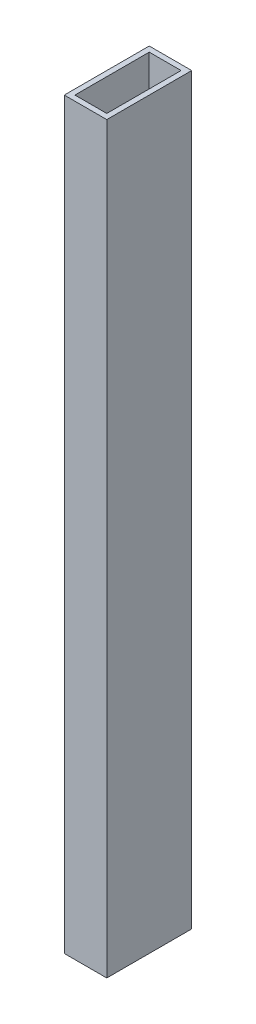
ISO-10303-21;
HEADER;
FILE_DESCRIPTION(('STEP AP214'),'2;1');
FILE_NAME('part.step','',(''),(''),'','','');
FILE_SCHEMA(('AUTOMOTIVE_DESIGN { 1 0 10303 214 1 1 1 1 }'));
ENDSEC;
DATA;
#1=APPLICATION_CONTEXT('core data for automotive mechanical design processes');
#2=APPLICATION_PROTOCOL_DEFINITION('international standard','automotive_design',2000,#1);
#3=PRODUCT_CONTEXT('',#1,'mechanical');
#4=PRODUCT('Part','Part','',(#3));
#5=PRODUCT_RELATED_PRODUCT_CATEGORY('part','',(#4));
#6=PRODUCT_DEFINITION_FORMATION('','',#4);
#7=PRODUCT_DEFINITION_CONTEXT('part definition',#1,'design');
#8=PRODUCT_DEFINITION('design','',#6,#7);
#9=PRODUCT_DEFINITION_SHAPE('','',#8);
#10=(LENGTH_UNIT() NAMED_UNIT(*) SI_UNIT(.MILLI.,.METRE.));
#11=(NAMED_UNIT(*) PLANE_ANGLE_UNIT() SI_UNIT($,.RADIAN.));
#12=(NAMED_UNIT(*) SI_UNIT($,.STERADIAN.) SOLID_ANGLE_UNIT());
#13=UNCERTAINTY_MEASURE_WITH_UNIT(LENGTH_MEASURE(1.E-05),#10,'distance_accuracy_value','');
#14=(GEOMETRIC_REPRESENTATION_CONTEXT(3) GLOBAL_UNCERTAINTY_ASSIGNED_CONTEXT((#13)) GLOBAL_UNIT_ASSIGNED_CONTEXT((#10,
#11,#12)) REPRESENTATION_CONTEXT('',''));
#15=CARTESIAN_POINT('',(0.,0.,0.));
#16=DIRECTION('',(0.,0.,1.));
#17=DIRECTION('',(1.,0.,0.));
#18=AXIS2_PLACEMENT_3D('',#15,#16,#17);
#19=CARTESIAN_POINT('',(0.,444.5,0.));
#20=DIRECTION('',(0.,-1.,0.));
#21=DIRECTION('',(0.,0.,-1.));
#22=AXIS2_PLACEMENT_3D('',#19,#20,#21);
#23=PLANE('',#22);
#24=DIRECTION('',(0.,0.,1.));
#25=VECTOR('',#24,1.);
#26=CARTESIAN_POINT('',(0.,444.5,0.));
#27=LINE('',#26,#25);
#28=CARTESIAN_POINT('',(0.,444.5,-50.8));
#29=VERTEX_POINT('',#28);
#30=CARTESIAN_POINT('',(0.,444.5,0.));
#31=VERTEX_POINT('',#30);
#32=EDGE_CURVE('E133',#29,#31,#27,.T.);
#33=ORIENTED_EDGE('',*,*,#32,.T.);
#34=DIRECTION('',(1.,0.,0.));
#35=VECTOR('',#34,1.);
#36=CARTESIAN_POINT('',(0.,444.5,0.));
#37=LINE('',#36,#35);
#38=CARTESIAN_POINT('',(25.4,444.5,0.));
#39=VERTEX_POINT('',#38);
#40=EDGE_CURVE('E136',#31,#39,#37,.T.);
#41=ORIENTED_EDGE('',*,*,#40,.T.);
#42=DIRECTION('',(0.,0.,-1.));
#43=VECTOR('',#42,1.);
#44=CARTESIAN_POINT('',(25.4,444.5,0.));
#45=LINE('',#44,#43);
#46=CARTESIAN_POINT('',(25.4,444.5,-50.8));
#47=VERTEX_POINT('',#46);
#48=EDGE_CURVE('E139',#39,#47,#45,.T.);
#49=ORIENTED_EDGE('',*,*,#48,.T.);
#50=DIRECTION('',(-1.,0.,0.));
#51=VECTOR('',#50,1.);
#52=CARTESIAN_POINT('',(0.,444.5,-50.8));
#53=LINE('',#52,#51);
#54=EDGE_CURVE('E141',#47,#29,#53,.T.);
#55=ORIENTED_EDGE('',*,*,#54,.T.);
#56=EDGE_LOOP('',(#33,#41,#49,#55));
#57=FACE_BOUND('',#56,.T.);
#58=DIRECTION('',(0.,0.,1.));
#59=VECTOR('',#58,1.);
#60=CARTESIAN_POINT('',(3.175,444.5,-47.625));
#61=LINE('',#60,#59);
#62=CARTESIAN_POINT('',(3.175,444.5,-47.625));
#63=VERTEX_POINT('',#62);
#64=CARTESIAN_POINT('',(3.17500000000001,444.5,-3.175));
#65=VERTEX_POINT('',#64);
#66=EDGE_CURVE('E97',#63,#65,#61,.T.);
#67=ORIENTED_EDGE('',*,*,#66,.F.);
#68=DIRECTION('',(-1.,0.,0.));
#69=VECTOR('',#68,1.);
#70=CARTESIAN_POINT('',(3.175,444.5,-47.625));
#71=LINE('',#70,#69);
#72=CARTESIAN_POINT('',(22.225,444.5,-47.625));
#73=VERTEX_POINT('',#72);
#74=EDGE_CURVE('E119',#73,#63,#71,.T.);
#75=ORIENTED_EDGE('',*,*,#74,.F.);
#76=DIRECTION('',(0.,0.,-1.));
#77=VECTOR('',#76,1.);
#78=CARTESIAN_POINT('',(22.225,444.5,-47.625));
#79=LINE('',#78,#77);
#80=CARTESIAN_POINT('',(22.225,444.5,-3.175));
#81=VERTEX_POINT('',#80);
#82=EDGE_CURVE('E117',#81,#73,#79,.T.);
#83=ORIENTED_EDGE('',*,*,#82,.F.);
#84=DIRECTION('',(1.,0.,0.));
#85=VECTOR('',#84,1.);
#86=CARTESIAN_POINT('',(3.17500000000001,444.5,-3.175));
#87=LINE('',#86,#85);
#88=EDGE_CURVE('E105',#65,#81,#87,.T.);
#89=ORIENTED_EDGE('',*,*,#88,.F.);
#90=EDGE_LOOP('',(#67,#75,#83,#89));
#91=FACE_BOUND('',#90,.T.);
#92=ADVANCED_FACE('F32',(#57,#91),#23,.F.);
#93=CARTESIAN_POINT('',(0.,0.,0.));
#94=DIRECTION('',(0.,-1.,0.));
#95=DIRECTION('',(0.,0.,-1.));
#96=AXIS2_PLACEMENT_3D('',#93,#94,#95);
#97=PLANE('',#96);
#98=DIRECTION('',(0.,0.,1.));
#99=VECTOR('',#98,1.);
#100=CARTESIAN_POINT('',(0.,0.,0.));
#101=LINE('',#100,#99);
#102=CARTESIAN_POINT('',(0.,0.,-50.8));
#103=VERTEX_POINT('',#102);
#104=CARTESIAN_POINT('',(0.,0.,0.));
#105=VERTEX_POINT('',#104);
#106=EDGE_CURVE('E113',#103,#105,#101,.T.);
#107=ORIENTED_EDGE('',*,*,#106,.F.);
#108=DIRECTION('',(-1.,0.,0.));
#109=VECTOR('',#108,1.);
#110=CARTESIAN_POINT('',(0.,0.,-50.8));
#111=LINE('',#110,#109);
#112=CARTESIAN_POINT('',(25.4,0.,-50.8));
#113=VERTEX_POINT('',#112);
#114=EDGE_CURVE('E137',#113,#103,#111,.T.);
#115=ORIENTED_EDGE('',*,*,#114,.F.);
#116=DIRECTION('',(0.,0.,-1.));
#117=VECTOR('',#116,1.);
#118=CARTESIAN_POINT('',(25.4,0.,0.));
#119=LINE('',#118,#117);
#120=CARTESIAN_POINT('',(25.4,0.,0.));
#121=VERTEX_POINT('',#120);
#122=EDGE_CURVE('E148',#121,#113,#119,.T.);
#123=ORIENTED_EDGE('',*,*,#122,.F.);
#124=DIRECTION('',(1.,0.,0.));
#125=VECTOR('',#124,1.);
#126=CARTESIAN_POINT('',(0.,0.,0.));
#127=LINE('',#126,#125);
#128=EDGE_CURVE('E146',#105,#121,#127,.T.);
#129=ORIENTED_EDGE('',*,*,#128,.F.);
#130=EDGE_LOOP('',(#107,#115,#123,#129));
#131=FACE_BOUND('',#130,.T.);
#132=DIRECTION('',(-1.,0.,0.));
#133=VECTOR('',#132,1.);
#134=CARTESIAN_POINT('',(3.175,0.,-47.625));
#135=LINE('',#134,#133);
#136=CARTESIAN_POINT('',(22.225,0.,-47.625));
#137=VERTEX_POINT('',#136);
#138=CARTESIAN_POINT('',(3.175,0.,-47.625));
#139=VERTEX_POINT('',#138);
#140=EDGE_CURVE('E106',#137,#139,#135,.T.);
#141=ORIENTED_EDGE('',*,*,#140,.T.);
#142=DIRECTION('',(0.,0.,1.));
#143=VECTOR('',#142,1.);
#144=CARTESIAN_POINT('',(3.175,0.,-47.625));
#145=LINE('',#144,#143);
#146=CARTESIAN_POINT('',(3.17500000000001,0.,-3.175));
#147=VERTEX_POINT('',#146);
#148=EDGE_CURVE('E55',#139,#147,#145,.T.);
#149=ORIENTED_EDGE('',*,*,#148,.T.);
#150=DIRECTION('',(1.,0.,0.));
#151=VECTOR('',#150,1.);
#152=CARTESIAN_POINT('',(3.17500000000001,0.,-3.175));
#153=LINE('',#152,#151);
#154=CARTESIAN_POINT('',(22.225,0.,-3.175));
#155=VERTEX_POINT('',#154);
#156=EDGE_CURVE('E112',#147,#155,#153,.T.);
#157=ORIENTED_EDGE('',*,*,#156,.T.);
#158=DIRECTION('',(0.,0.,-1.));
#159=VECTOR('',#158,1.);
#160=CARTESIAN_POINT('',(22.225,0.,-47.625));
#161=LINE('',#160,#159);
#162=EDGE_CURVE('E125',#155,#137,#161,.T.);
#163=ORIENTED_EDGE('',*,*,#162,.T.);
#164=EDGE_LOOP('',(#141,#149,#157,#163));
#165=FACE_BOUND('',#164,.T.);
#166=ADVANCED_FACE('F166',(#131,#165),#97,.T.);
#167=CARTESIAN_POINT('',(0.,444.5,0.));
#168=DIRECTION('',(1.,0.,0.));
#169=DIRECTION('',(0.,0.,-1.));
#170=AXIS2_PLACEMENT_3D('',#167,#168,#169);
#171=PLANE('',#170);
#172=ORIENTED_EDGE('',*,*,#106,.T.);
#173=DIRECTION('',(0.,-1.,0.));
#174=VECTOR('',#173,1.);
#175=CARTESIAN_POINT('',(0.,444.5,0.));
#176=LINE('',#175,#174);
#177=EDGE_CURVE('E11',#31,#105,#176,.T.);
#178=ORIENTED_EDGE('',*,*,#177,.F.);
#179=ORIENTED_EDGE('',*,*,#32,.F.);
#180=DIRECTION('',(0.,-1.,0.));
#181=VECTOR('',#180,1.);
#182=CARTESIAN_POINT('',(0.,444.5,-50.8));
#183=LINE('',#182,#181);
#184=EDGE_CURVE('E143',#29,#103,#183,.T.);
#185=ORIENTED_EDGE('',*,*,#184,.T.);
#186=EDGE_LOOP('',(#172,#178,#179,#185));
#187=FACE_BOUND('',#186,.T.);
#188=ADVANCED_FACE('F34',(#187),#171,.F.);
#189=CARTESIAN_POINT('',(0.,444.5,0.));
#190=DIRECTION('',(0.,0.,-1.));
#191=DIRECTION('',(-1.,0.,0.));
#192=AXIS2_PLACEMENT_3D('',#189,#190,#191);
#193=PLANE('',#192);
#194=ORIENTED_EDGE('',*,*,#128,.T.);
#195=DIRECTION('',(0.,-1.,0.));
#196=VECTOR('',#195,1.);
#197=CARTESIAN_POINT('',(25.4,444.5,0.));
#198=LINE('',#197,#196);
#199=EDGE_CURVE('E40',#39,#121,#198,.T.);
#200=ORIENTED_EDGE('',*,*,#199,.F.);
#201=ORIENTED_EDGE('',*,*,#40,.F.);
#202=ORIENTED_EDGE('',*,*,#177,.T.);
#203=EDGE_LOOP('',(#194,#200,#201,#202));
#204=FACE_BOUND('',#203,.T.);
#205=ADVANCED_FACE('F176',(#204),#193,.F.);
#206=CARTESIAN_POINT('',(25.4,444.5,0.));
#207=DIRECTION('',(-1.,0.,0.));
#208=DIRECTION('',(0.,0.,1.));
#209=AXIS2_PLACEMENT_3D('',#206,#207,#208);
#210=PLANE('',#209);
#211=ORIENTED_EDGE('',*,*,#122,.T.);
#212=DIRECTION('',(0.,-1.,0.));
#213=VECTOR('',#212,1.);
#214=CARTESIAN_POINT('',(25.4,444.5,-50.8));
#215=LINE('',#214,#213);
#216=EDGE_CURVE('E153',#47,#113,#215,.T.);
#217=ORIENTED_EDGE('',*,*,#216,.F.);
#218=ORIENTED_EDGE('',*,*,#48,.F.);
#219=ORIENTED_EDGE('',*,*,#199,.T.);
#220=EDGE_LOOP('',(#211,#217,#218,#219));
#221=FACE_BOUND('',#220,.T.);
#222=ADVANCED_FACE('F160',(#221),#210,.F.);
#223=CARTESIAN_POINT('',(0.,444.5,-50.8));
#224=DIRECTION('',(0.,0.,1.));
#225=DIRECTION('',(1.,0.,0.));
#226=AXIS2_PLACEMENT_3D('',#223,#224,#225);
#227=PLANE('',#226);
#228=ORIENTED_EDGE('',*,*,#114,.T.);
#229=ORIENTED_EDGE('',*,*,#184,.F.);
#230=ORIENTED_EDGE('',*,*,#54,.F.);
#231=ORIENTED_EDGE('',*,*,#216,.T.);
#232=EDGE_LOOP('',(#228,#229,#230,#231));
#233=FACE_BOUND('',#232,.T.);
#234=ADVANCED_FACE('F170',(#233),#227,.F.);
#235=CARTESIAN_POINT('',(3.175,444.5,-47.625));
#236=DIRECTION('',(1.,0.,0.));
#237=DIRECTION('',(0.,0.,-1.));
#238=AXIS2_PLACEMENT_3D('',#235,#236,#237);
#239=PLANE('',#238);
#240=ORIENTED_EDGE('',*,*,#148,.F.);
#241=DIRECTION('',(0.,-1.,0.));
#242=VECTOR('',#241,1.);
#243=CARTESIAN_POINT('',(3.175,444.5,-47.625));
#244=LINE('',#243,#242);
#245=EDGE_CURVE('E101',#63,#139,#244,.T.);
#246=ORIENTED_EDGE('',*,*,#245,.F.);
#247=ORIENTED_EDGE('',*,*,#66,.T.);
#248=DIRECTION('',(0.,-1.,0.));
#249=VECTOR('',#248,1.);
#250=CARTESIAN_POINT('',(3.17500000000001,444.5,-3.175));
#251=LINE('',#250,#249);
#252=EDGE_CURVE('E100',#65,#147,#251,.T.);
#253=ORIENTED_EDGE('',*,*,#252,.T.);
#254=EDGE_LOOP('',(#240,#246,#247,#253));
#255=FACE_BOUND('',#254,.T.);
#256=ADVANCED_FACE('F99',(#255),#239,.T.);
#257=CARTESIAN_POINT('',(3.17500000000001,444.5,-3.175));
#258=DIRECTION('',(0.,0.,-1.));
#259=DIRECTION('',(-1.,0.,0.));
#260=AXIS2_PLACEMENT_3D('',#257,#258,#259);
#261=PLANE('',#260);
#262=ORIENTED_EDGE('',*,*,#156,.F.);
#263=ORIENTED_EDGE('',*,*,#252,.F.);
#264=ORIENTED_EDGE('',*,*,#88,.T.);
#265=DIRECTION('',(0.,-1.,0.));
#266=VECTOR('',#265,1.);
#267=CARTESIAN_POINT('',(22.225,444.5,-3.175));
#268=LINE('',#267,#266);
#269=EDGE_CURVE('E114',#81,#155,#268,.T.);
#270=ORIENTED_EDGE('',*,*,#269,.T.);
#271=EDGE_LOOP('',(#262,#263,#264,#270));
#272=FACE_BOUND('',#271,.T.);
#273=ADVANCED_FACE('F109',(#272),#261,.T.);
#274=CARTESIAN_POINT('',(22.225,444.5,-47.625));
#275=DIRECTION('',(-1.,0.,0.));
#276=DIRECTION('',(0.,0.,1.));
#277=AXIS2_PLACEMENT_3D('',#274,#275,#276);
#278=PLANE('',#277);
#279=ORIENTED_EDGE('',*,*,#162,.F.);
#280=ORIENTED_EDGE('',*,*,#269,.F.);
#281=ORIENTED_EDGE('',*,*,#82,.T.);
#282=DIRECTION('',(0.,-1.,0.));
#283=VECTOR('',#282,1.);
#284=CARTESIAN_POINT('',(22.225,444.5,-47.625));
#285=LINE('',#284,#283);
#286=EDGE_CURVE('E47',#73,#137,#285,.T.);
#287=ORIENTED_EDGE('',*,*,#286,.T.);
#288=EDGE_LOOP('',(#279,#280,#281,#287));
#289=FACE_BOUND('',#288,.T.);
#290=ADVANCED_FACE('F199',(#289),#278,.T.);
#291=CARTESIAN_POINT('',(3.175,444.5,-47.625));
#292=DIRECTION('',(0.,0.,1.));
#293=DIRECTION('',(1.,0.,0.));
#294=AXIS2_PLACEMENT_3D('',#291,#292,#293);
#295=PLANE('',#294);
#296=ORIENTED_EDGE('',*,*,#140,.F.);
#297=ORIENTED_EDGE('',*,*,#286,.F.);
#298=ORIENTED_EDGE('',*,*,#74,.T.);
#299=ORIENTED_EDGE('',*,*,#245,.T.);
#300=EDGE_LOOP('',(#296,#297,#298,#299));
#301=FACE_BOUND('',#300,.T.);
#302=ADVANCED_FACE('F203',(#301),#295,.T.);
#303=CLOSED_SHELL('',(#92,#166,#188,#205,#222,#234,#256,#273,#290,#302));
#304=MANIFOLD_SOLID_BREP('B2',#303);
#305=ADVANCED_BREP_SHAPE_REPRESENTATION('',(#18,#304),#14);
#306=SHAPE_DEFINITION_REPRESENTATION(#9,#305);
ENDSEC;
END-ISO-10303-21;
